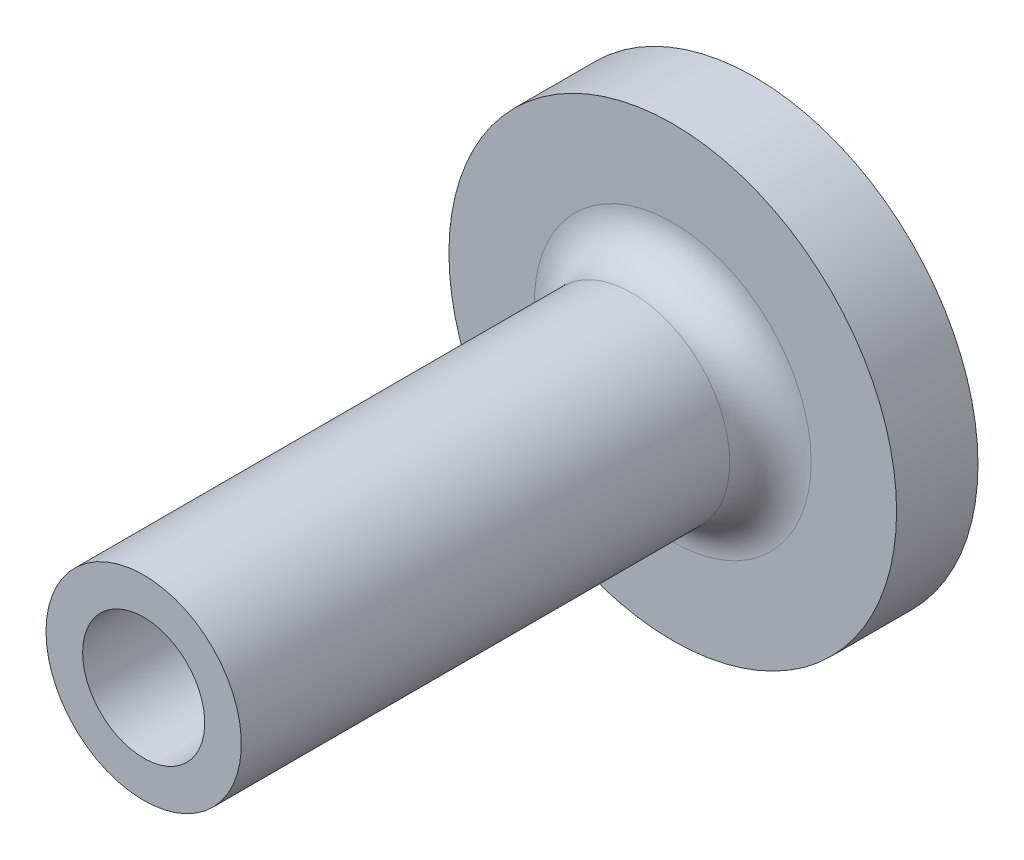
ISO-10303-21;
HEADER;
FILE_DESCRIPTION(('STEP AP214'),'2;1');
FILE_NAME('part.step','',(''),(''),'','','');
FILE_SCHEMA(('AUTOMOTIVE_DESIGN { 1 0 10303 214 1 1 1 1 }'));
ENDSEC;
DATA;
#1=APPLICATION_CONTEXT('core data for automotive mechanical design processes');
#2=APPLICATION_PROTOCOL_DEFINITION('international standard','automotive_design',2000,#1);
#3=PRODUCT_CONTEXT('',#1,'mechanical');
#4=PRODUCT('Part','Part','',(#3));
#5=PRODUCT_RELATED_PRODUCT_CATEGORY('part','',(#4));
#6=PRODUCT_DEFINITION_FORMATION('','',#4);
#7=PRODUCT_DEFINITION_CONTEXT('part definition',#1,'design');
#8=PRODUCT_DEFINITION('design','',#6,#7);
#9=PRODUCT_DEFINITION_SHAPE('','',#8);
#10=(LENGTH_UNIT() NAMED_UNIT(*) SI_UNIT(.MILLI.,.METRE.));
#11=(NAMED_UNIT(*) PLANE_ANGLE_UNIT() SI_UNIT($,.RADIAN.));
#12=(NAMED_UNIT(*) SI_UNIT($,.STERADIAN.) SOLID_ANGLE_UNIT());
#13=UNCERTAINTY_MEASURE_WITH_UNIT(LENGTH_MEASURE(1.E-05),#10,'distance_accuracy_value','');
#14=(GEOMETRIC_REPRESENTATION_CONTEXT(3) GLOBAL_UNCERTAINTY_ASSIGNED_CONTEXT((#13)) GLOBAL_UNIT_ASSIGNED_CONTEXT((#10,
#11,#12)) REPRESENTATION_CONTEXT('',''));
#15=CARTESIAN_POINT('',(0.,0.,0.));
#16=DIRECTION('',(0.,0.,1.));
#17=DIRECTION('',(1.,0.,0.));
#18=AXIS2_PLACEMENT_3D('',#15,#16,#17);
#19=CARTESIAN_POINT('',(0.,0.,2.));
#20=DIRECTION('',(0.,0.,-1.));
#21=DIRECTION('',(-1.,0.,0.));
#22=AXIS2_PLACEMENT_3D('',#19,#20,#21);
#23=CYLINDRICAL_SURFACE('',#22,5.5);
#24=CARTESIAN_POINT('',(0.,0.,2.));
#25=DIRECTION('',(0.,0.,1.));
#26=DIRECTION('',(1.,0.,0.));
#27=AXIS2_PLACEMENT_3D('',#24,#25,#26);
#28=CIRCLE('',#27,5.5);
#29=CARTESIAN_POINT('',(5.5,0.,2.));
#30=VERTEX_POINT('',#29);
#31=EDGE_CURVE('E50',#30,#30,#28,.T.);
#32=ORIENTED_EDGE('',*,*,#31,.F.);
#33=EDGE_LOOP('',(#32));
#34=FACE_BOUND('',#33,.T.);
#35=CARTESIAN_POINT('',(0.,0.,0.));
#36=DIRECTION('',(0.,0.,1.));
#37=DIRECTION('',(1.,0.,0.));
#38=AXIS2_PLACEMENT_3D('',#35,#36,#37);
#39=CIRCLE('',#38,5.5);
#40=CARTESIAN_POINT('',(5.5,0.,0.));
#41=VERTEX_POINT('',#40);
#42=EDGE_CURVE('E53',#41,#41,#39,.T.);
#43=ORIENTED_EDGE('',*,*,#42,.T.);
#44=EDGE_LOOP('',(#43));
#45=FACE_BOUND('',#44,.T.);
#46=ADVANCED_FACE('F35',(#34,#45),#23,.T.);
#47=CARTESIAN_POINT('',(0.,0.,2.));
#48=DIRECTION('',(0.,0.,1.));
#49=DIRECTION('',(1.,0.,0.));
#50=AXIS2_PLACEMENT_3D('',#47,#48,#49);
#51=PLANE('',#50);
#52=CARTESIAN_POINT('',(0.,0.,2.));
#53=DIRECTION('',(0.,0.,1.));
#54=DIRECTION('',(1.,0.,0.));
#55=AXIS2_PLACEMENT_3D('',#52,#53,#54);
#56=CIRCLE('',#55,3.4);
#57=CARTESIAN_POINT('',(3.4,0.,2.));
#58=VERTEX_POINT('',#57);
#59=EDGE_CURVE('E10',#58,#58,#56,.F.);
#60=ORIENTED_EDGE('',*,*,#59,.T.);
#61=EDGE_LOOP('',(#60));
#62=FACE_BOUND('',#61,.T.);
#63=ORIENTED_EDGE('',*,*,#31,.T.);
#64=EDGE_LOOP('',(#63));
#65=FACE_BOUND('',#64,.T.);
#66=ADVANCED_FACE('F79',(#62,#65),#51,.T.);
#67=CARTESIAN_POINT('',(0.,0.,0.));
#68=DIRECTION('',(0.,0.,1.));
#69=DIRECTION('',(1.,0.,0.));
#70=AXIS2_PLACEMENT_3D('',#67,#68,#69);
#71=PLANE('',#70);
#72=ORIENTED_EDGE('',*,*,#42,.F.);
#73=EDGE_LOOP('',(#72));
#74=FACE_BOUND('',#73,.T.);
#75=ADVANCED_FACE('F71',(#74),#71,.F.);
#76=CARTESIAN_POINT('',(0.,0.,15.));
#77=DIRECTION('',(0.,0.,1.));
#78=DIRECTION('',(1.,0.,0.));
#79=AXIS2_PLACEMENT_3D('',#76,#77,#78);
#80=PLANE('',#79);
#81=CARTESIAN_POINT('',(0.,0.,15.));
#82=DIRECTION('',(0.,0.,1.));
#83=DIRECTION('',(1.,0.,0.));
#84=AXIS2_PLACEMENT_3D('',#81,#82,#83);
#85=CIRCLE('',#84,2.4);
#86=CARTESIAN_POINT('',(-2.4,0.,15.));
#87=VERTEX_POINT('',#86);
#88=EDGE_CURVE('E56',#87,#87,#85,.T.);
#89=ORIENTED_EDGE('',*,*,#88,.T.);
#90=EDGE_LOOP('',(#89));
#91=FACE_BOUND('',#90,.T.);
#92=CARTESIAN_POINT('',(0.,0.,15.));
#93=DIRECTION('',(0.,0.,1.));
#94=DIRECTION('',(1.,0.,0.));
#95=AXIS2_PLACEMENT_3D('',#92,#93,#94);
#96=CIRCLE('',#95,1.5);
#97=CARTESIAN_POINT('',(-1.5,0.,15.));
#98=VERTEX_POINT('',#97);
#99=EDGE_CURVE('E61',#98,#98,#96,.T.);
#100=ORIENTED_EDGE('',*,*,#99,.F.);
#101=EDGE_LOOP('',(#100));
#102=FACE_BOUND('',#101,.T.);
#103=ADVANCED_FACE('F68',(#91,#102),#80,.T.);
#104=CARTESIAN_POINT('',(0.,0.,15.));
#105=DIRECTION('',(0.,0.,-1.));
#106=DIRECTION('',(-1.,0.,0.));
#107=AXIS2_PLACEMENT_3D('',#104,#105,#106);
#108=CYLINDRICAL_SURFACE('',#107,2.4);
#109=CARTESIAN_POINT('',(0.,0.,3.));
#110=DIRECTION('',(0.,0.,1.));
#111=DIRECTION('',(1.,0.,0.));
#112=AXIS2_PLACEMENT_3D('',#109,#110,#111);
#113=CIRCLE('',#112,2.4);
#114=CARTESIAN_POINT('',(-2.4,0.,3.));
#115=VERTEX_POINT('',#114);
#116=EDGE_CURVE('E42',#115,#115,#113,.T.);
#117=CARTESIAN_POINT('',(-2.4,0.,3.));
#118=CARTESIAN_POINT('',(-2.4,0.,3.125));
#119=CARTESIAN_POINT('',(-2.4,0.,3.25));
#120=CARTESIAN_POINT('',(-2.4,0.,3.5));
#121=CARTESIAN_POINT('',(-2.4,0.,3.625));
#122=CARTESIAN_POINT('',(-2.4,0.,3.875));
#123=CARTESIAN_POINT('',(-2.4,0.,4.));
#124=CARTESIAN_POINT('',(-2.4,0.,4.25));
#125=CARTESIAN_POINT('',(-2.4,0.,4.375));
#126=CARTESIAN_POINT('',(-2.4,0.,4.625));
#127=CARTESIAN_POINT('',(-2.4,0.,4.75));
#128=CARTESIAN_POINT('',(-2.4,0.,5.));
#129=CARTESIAN_POINT('',(-2.4,0.,5.125));
#130=CARTESIAN_POINT('',(-2.4,0.,5.375));
#131=CARTESIAN_POINT('',(-2.4,0.,5.5));
#132=CARTESIAN_POINT('',(-2.4,0.,5.75));
#133=CARTESIAN_POINT('',(-2.4,0.,5.875));
#134=CARTESIAN_POINT('',(-2.4,0.,6.125));
#135=CARTESIAN_POINT('',(-2.4,0.,6.25));
#136=CARTESIAN_POINT('',(-2.4,0.,6.5));
#137=CARTESIAN_POINT('',(-2.4,0.,6.625));
#138=CARTESIAN_POINT('',(-2.4,0.,6.875));
#139=CARTESIAN_POINT('',(-2.4,0.,7.));
#140=CARTESIAN_POINT('',(-2.4,0.,7.25));
#141=CARTESIAN_POINT('',(-2.4,0.,7.375));
#142=CARTESIAN_POINT('',(-2.4,0.,7.625));
#143=CARTESIAN_POINT('',(-2.4,0.,7.75));
#144=CARTESIAN_POINT('',(-2.4,0.,8.));
#145=CARTESIAN_POINT('',(-2.4,0.,8.125));
#146=CARTESIAN_POINT('',(-2.4,0.,8.375));
#147=CARTESIAN_POINT('',(-2.4,0.,8.5));
#148=CARTESIAN_POINT('',(-2.4,0.,8.75));
#149=CARTESIAN_POINT('',(-2.4,0.,8.875));
#150=CARTESIAN_POINT('',(-2.4,0.,9.125));
#151=CARTESIAN_POINT('',(-2.4,0.,9.25));
#152=CARTESIAN_POINT('',(-2.4,0.,9.5));
#153=CARTESIAN_POINT('',(-2.4,0.,9.625));
#154=CARTESIAN_POINT('',(-2.4,0.,9.875));
#155=CARTESIAN_POINT('',(-2.4,0.,10.));
#156=CARTESIAN_POINT('',(-2.4,0.,10.25));
#157=CARTESIAN_POINT('',(-2.4,0.,10.375));
#158=CARTESIAN_POINT('',(-2.4,0.,10.625));
#159=CARTESIAN_POINT('',(-2.4,0.,10.75));
#160=CARTESIAN_POINT('',(-2.4,0.,11.));
#161=CARTESIAN_POINT('',(-2.4,0.,11.125));
#162=CARTESIAN_POINT('',(-2.4,0.,11.375));
#163=CARTESIAN_POINT('',(-2.4,0.,11.5));
#164=CARTESIAN_POINT('',(-2.4,0.,11.75));
#165=CARTESIAN_POINT('',(-2.4,0.,11.875));
#166=CARTESIAN_POINT('',(-2.4,0.,12.125));
#167=CARTESIAN_POINT('',(-2.4,0.,12.25));
#168=CARTESIAN_POINT('',(-2.4,0.,12.5));
#169=CARTESIAN_POINT('',(-2.4,0.,12.625));
#170=CARTESIAN_POINT('',(-2.4,0.,12.875));
#171=CARTESIAN_POINT('',(-2.4,0.,13.));
#172=CARTESIAN_POINT('',(-2.4,0.,13.25));
#173=CARTESIAN_POINT('',(-2.4,0.,13.375));
#174=CARTESIAN_POINT('',(-2.4,0.,13.625));
#175=CARTESIAN_POINT('',(-2.4,0.,13.75));
#176=CARTESIAN_POINT('',(-2.4,0.,14.));
#177=CARTESIAN_POINT('',(-2.4,0.,14.125));
#178=CARTESIAN_POINT('',(-2.4,0.,14.375));
#179=CARTESIAN_POINT('',(-2.4,0.,14.5));
#180=CARTESIAN_POINT('',(-2.4,0.,14.75));
#181=CARTESIAN_POINT('',(-2.4,0.,14.875));
#182=CARTESIAN_POINT('',(-2.4,0.,15.));
#183=B_SPLINE_CURVE_WITH_KNOTS('',3,(#117,#118,#119,#120,#121,#122,#123,#124,#125,#126,#127,
#128,#129,#130,#131,#132,#133,#134,#135,#136,#137,#138,#139,#140,#141,#142,#143,#144,#145,#146,
#147,#148,#149,#150,#151,#152,#153,#154,#155,#156,#157,#158,#159,#160,#161,#162,#163,#164,#165,
#166,#167,#168,#169,#170,#171,#172,#173,#174,#175,#176,#177,#178,#179,#180,#181,#182),
.UNSPECIFIED.,.F.,.F.,(4,2,2,2,2,2,2,2,2,2,2,2,2,2,2,2,2,2,2,2,2,2,2,2,2,2,2,2,2,2,2,2,4),(0.,
0.375,0.750000000000001,1.125,1.5,1.875,2.25,2.625,3.,3.375,3.75,4.125,4.5,4.875,5.25,5.625,6.,
6.375,6.75,7.125,7.5,7.875,8.25,8.625,9.,9.375,9.75,10.125,10.5,10.875,11.25,11.625,12.),.UNSPECIFIED.);
#184=EDGE_CURVE('BSEAM70',#115,#87,#183,.T.);
#185=ORIENTED_EDGE('',*,*,#116,.T.);
#186=ORIENTED_EDGE('',*,*,#88,.F.);
#187=ORIENTED_EDGE('',*,*,#184,.T.);
#188=ORIENTED_EDGE('',*,*,#184,.F.);
#189=EDGE_LOOP('',(#185,#187,#186,#188));
#190=FACE_BOUND('',#189,.T.);
#191=ADVANCED_FACE('F70',(#190),#108,.T.);
#192=CARTESIAN_POINT('',(0.,0.,15.));
#193=DIRECTION('',(0.,0.,-1.));
#194=DIRECTION('',(-1.,0.,0.));
#195=AXIS2_PLACEMENT_3D('',#192,#193,#194);
#196=CYLINDRICAL_SURFACE('',#195,1.5);
#197=CARTESIAN_POINT('',(0.,0.,2.));
#198=DIRECTION('',(0.,0.,1.));
#199=DIRECTION('',(1.,0.,0.));
#200=AXIS2_PLACEMENT_3D('',#197,#198,#199);
#201=CIRCLE('',#200,1.5);
#202=CARTESIAN_POINT('',(-1.5,0.,2.));
#203=VERTEX_POINT('',#202);
#204=EDGE_CURVE('E46',#203,#203,#201,.F.);
#205=CARTESIAN_POINT('',(-1.5,0.,15.));
#206=CARTESIAN_POINT('',(-1.5,0.,14.8645833333333));
#207=CARTESIAN_POINT('',(-1.5,0.,14.7291666666667));
#208=CARTESIAN_POINT('',(-1.5,0.,14.4583333333333));
#209=CARTESIAN_POINT('',(-1.5,0.,14.3229166666667));
#210=CARTESIAN_POINT('',(-1.5,0.,14.0520833333333));
#211=CARTESIAN_POINT('',(-1.5,0.,13.9166666666667));
#212=CARTESIAN_POINT('',(-1.5,0.,13.6458333333333));
#213=CARTESIAN_POINT('',(-1.5,0.,13.5104166666667));
#214=CARTESIAN_POINT('',(-1.5,0.,13.2395833333333));
#215=CARTESIAN_POINT('',(-1.5,0.,13.1041666666667));
#216=CARTESIAN_POINT('',(-1.5,0.,12.8333333333333));
#217=CARTESIAN_POINT('',(-1.5,0.,12.6979166666667));
#218=CARTESIAN_POINT('',(-1.5,0.,12.4270833333333));
#219=CARTESIAN_POINT('',(-1.5,0.,12.2916666666667));
#220=CARTESIAN_POINT('',(-1.5,0.,12.0208333333333));
#221=CARTESIAN_POINT('',(-1.5,0.,11.8854166666667));
#222=CARTESIAN_POINT('',(-1.5,0.,11.6145833333333));
#223=CARTESIAN_POINT('',(-1.5,0.,11.4791666666667));
#224=CARTESIAN_POINT('',(-1.5,0.,11.2083333333333));
#225=CARTESIAN_POINT('',(-1.5,0.,11.0729166666667));
#226=CARTESIAN_POINT('',(-1.5,0.,10.8020833333333));
#227=CARTESIAN_POINT('',(-1.5,0.,10.6666666666667));
#228=CARTESIAN_POINT('',(-1.5,0.,10.3958333333333));
#229=CARTESIAN_POINT('',(-1.5,0.,10.2604166666667));
#230=CARTESIAN_POINT('',(-1.5,0.,9.98958333333333));
#231=CARTESIAN_POINT('',(-1.5,0.,9.85416666666667));
#232=CARTESIAN_POINT('',(-1.5,0.,9.58333333333333));
#233=CARTESIAN_POINT('',(-1.5,0.,9.44791666666667));
#234=CARTESIAN_POINT('',(-1.5,0.,9.17708333333333));
#235=CARTESIAN_POINT('',(-1.5,0.,9.04166666666667));
#236=CARTESIAN_POINT('',(-1.5,0.,8.77083333333333));
#237=CARTESIAN_POINT('',(-1.5,0.,8.63541666666667));
#238=CARTESIAN_POINT('',(-1.5,0.,8.36458333333333));
#239=CARTESIAN_POINT('',(-1.5,0.,8.22916666666667));
#240=CARTESIAN_POINT('',(-1.5,0.,7.95833333333333));
#241=CARTESIAN_POINT('',(-1.5,0.,7.82291666666667));
#242=CARTESIAN_POINT('',(-1.5,0.,7.55208333333333));
#243=CARTESIAN_POINT('',(-1.5,0.,7.41666666666667));
#244=CARTESIAN_POINT('',(-1.5,0.,7.14583333333333));
#245=CARTESIAN_POINT('',(-1.5,0.,7.01041666666667));
#246=CARTESIAN_POINT('',(-1.5,0.,6.73958333333333));
#247=CARTESIAN_POINT('',(-1.5,0.,6.60416666666667));
#248=CARTESIAN_POINT('',(-1.5,0.,6.33333333333333));
#249=CARTESIAN_POINT('',(-1.5,0.,6.19791666666667));
#250=CARTESIAN_POINT('',(-1.5,0.,5.92708333333333));
#251=CARTESIAN_POINT('',(-1.5,0.,5.79166666666667));
#252=CARTESIAN_POINT('',(-1.5,0.,5.52083333333333));
#253=CARTESIAN_POINT('',(-1.5,0.,5.38541666666667));
#254=CARTESIAN_POINT('',(-1.5,0.,5.11458333333333));
#255=CARTESIAN_POINT('',(-1.5,0.,4.97916666666667));
#256=CARTESIAN_POINT('',(-1.5,0.,4.70833333333333));
#257=CARTESIAN_POINT('',(-1.5,0.,4.57291666666667));
#258=CARTESIAN_POINT('',(-1.5,0.,4.30208333333333));
#259=CARTESIAN_POINT('',(-1.5,0.,4.16666666666667));
#260=CARTESIAN_POINT('',(-1.5,0.,3.89583333333333));
#261=CARTESIAN_POINT('',(-1.5,0.,3.76041666666667));
#262=CARTESIAN_POINT('',(-1.5,0.,3.48958333333333));
#263=CARTESIAN_POINT('',(-1.5,0.,3.35416666666667));
#264=CARTESIAN_POINT('',(-1.5,0.,3.08333333333333));
#265=CARTESIAN_POINT('',(-1.5,0.,2.94791666666667));
#266=CARTESIAN_POINT('',(-1.5,0.,2.67708333333333));
#267=CARTESIAN_POINT('',(-1.5,0.,2.54166666666667));
#268=CARTESIAN_POINT('',(-1.5,0.,2.27083333333333));
#269=CARTESIAN_POINT('',(-1.5,0.,2.13541666666666));
#270=CARTESIAN_POINT('',(-1.5,0.,2.));
#271=B_SPLINE_CURVE_WITH_KNOTS('',3,(#205,#206,#207,#208,#209,#210,#211,#212,#213,#214,#215,
#216,#217,#218,#219,#220,#221,#222,#223,#224,#225,#226,#227,#228,#229,#230,#231,#232,#233,#234,
#235,#236,#237,#238,#239,#240,#241,#242,#243,#244,#245,#246,#247,#248,#249,#250,#251,#252,#253,
#254,#255,#256,#257,#258,#259,#260,#261,#262,#263,#264,#265,#266,#267,#268,#269,#270),
.UNSPECIFIED.,.F.,.F.,(4,2,2,2,2,2,2,2,2,2,2,2,2,2,2,2,2,2,2,2,2,2,2,2,2,2,2,2,2,2,2,2,4),(0.,
0.40625,0.812500000000001,1.21875,1.625,2.03125,2.4375,2.84375,3.25,3.65625,4.0625,4.46875,
4.875,5.28125,5.6875,6.09375,6.5,6.90625,7.3125,7.71875000000001,8.125,8.53125,8.93750000000001,
9.34375000000001,9.75,10.15625,10.5625,10.96875,11.375,11.78125,12.1875,12.59375,13.),.UNSPECIFIED.);
#272=EDGE_CURVE('BSEAM65',#98,#203,#271,.T.);
#273=ORIENTED_EDGE('',*,*,#99,.T.);
#274=ORIENTED_EDGE('',*,*,#204,.T.);
#275=ORIENTED_EDGE('',*,*,#272,.T.);
#276=ORIENTED_EDGE('',*,*,#272,.F.);
#277=EDGE_LOOP('',(#273,#275,#274,#276));
#278=FACE_BOUND('',#277,.T.);
#279=ADVANCED_FACE('F65',(#278),#196,.F.);
#280=ORIENTED_EDGE('',*,*,#204,.F.);
#281=EDGE_LOOP('',(#280));
#282=FACE_BOUND('',#281,.T.);
#283=ADVANCED_FACE('F89',(#282),#51,.T.);
#284=CARTESIAN_POINT('',(0.,0.,3.));
#285=DIRECTION('',(0.,0.,1.));
#286=DIRECTION('',(1.,0.,0.));
#287=AXIS2_PLACEMENT_3D('',#284,#285,#286);
#288=TOROIDAL_SURFACE('',#287,3.4,1.);
#289=ORIENTED_EDGE('',*,*,#59,.F.);
#290=EDGE_LOOP('',(#289));
#291=FACE_BOUND('',#290,.T.);
#292=ORIENTED_EDGE('',*,*,#116,.F.);
#293=EDGE_LOOP('',(#292));
#294=FACE_BOUND('',#293,.T.);
#295=ADVANCED_FACE('F37',(#291,#294),#288,.F.);
#296=CLOSED_SHELL('',(#46,#66,#75,#103,#191,#279,#283,#295));
#297=MANIFOLD_SOLID_BREP('B2',#296);
#298=ADVANCED_BREP_SHAPE_REPRESENTATION('',(#18,#297),#14);
#299=SHAPE_DEFINITION_REPRESENTATION(#9,#298);
ENDSEC;
END-ISO-10303-21;
